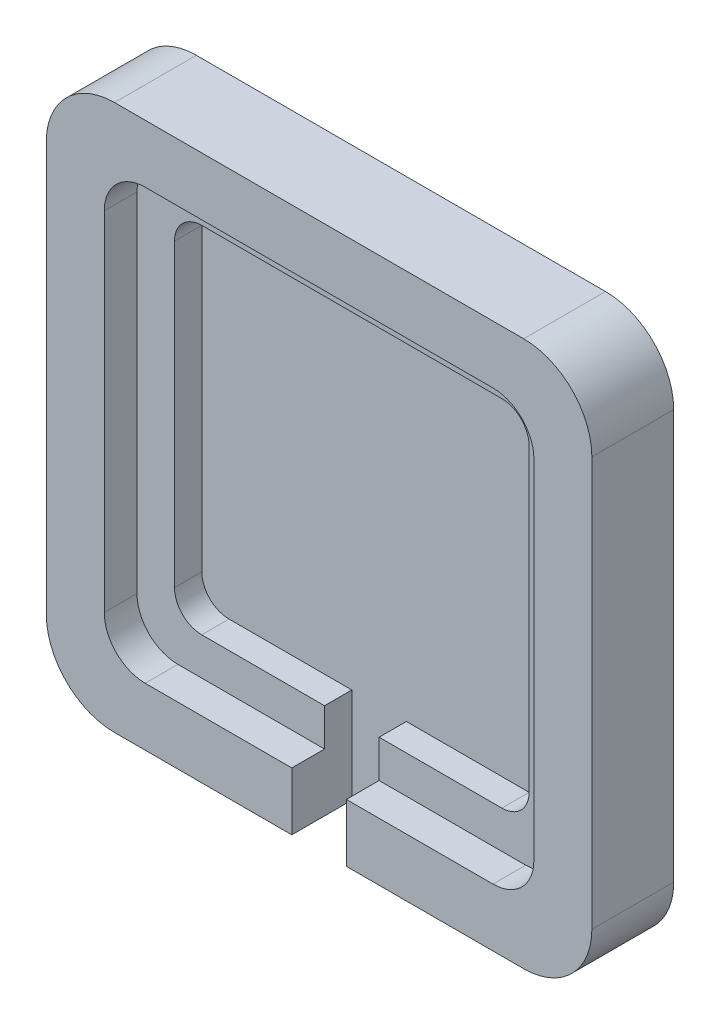
ISO-10303-21;
HEADER;
FILE_DESCRIPTION(('STEP AP214'),'2;1');
FILE_NAME('part.step','',(''),(''),'','','');
FILE_SCHEMA(('AUTOMOTIVE_DESIGN { 1 0 10303 214 1 1 1 1 }'));
ENDSEC;
DATA;
#1=APPLICATION_CONTEXT('core data for automotive mechanical design processes');
#2=APPLICATION_PROTOCOL_DEFINITION('international standard','automotive_design',2000,#1);
#3=PRODUCT_CONTEXT('',#1,'mechanical');
#4=PRODUCT('Part','Part','',(#3));
#5=PRODUCT_RELATED_PRODUCT_CATEGORY('part','',(#4));
#6=PRODUCT_DEFINITION_FORMATION('','',#4);
#7=PRODUCT_DEFINITION_CONTEXT('part definition',#1,'design');
#8=PRODUCT_DEFINITION('design','',#6,#7);
#9=PRODUCT_DEFINITION_SHAPE('','',#8);
#10=(LENGTH_UNIT() NAMED_UNIT(*) SI_UNIT(.MILLI.,.METRE.));
#11=(NAMED_UNIT(*) PLANE_ANGLE_UNIT() SI_UNIT($,.RADIAN.));
#12=(NAMED_UNIT(*) SI_UNIT($,.STERADIAN.) SOLID_ANGLE_UNIT());
#13=UNCERTAINTY_MEASURE_WITH_UNIT(LENGTH_MEASURE(1.E-05),#10,'distance_accuracy_value','');
#14=(GEOMETRIC_REPRESENTATION_CONTEXT(3) GLOBAL_UNCERTAINTY_ASSIGNED_CONTEXT((#13)) GLOBAL_UNIT_ASSIGNED_CONTEXT((#10,
#11,#12)) REPRESENTATION_CONTEXT('',''));
#15=CARTESIAN_POINT('',(0.,0.,0.));
#16=DIRECTION('',(0.,0.,1.));
#17=DIRECTION('',(1.,0.,0.));
#18=AXIS2_PLACEMENT_3D('',#15,#16,#17);
#19=CARTESIAN_POINT('',(15.75,-15.75,3.6));
#20=DIRECTION('',(0.,-1.,0.));
#21=DIRECTION('',(1.,0.,0.));
#22=AXIS2_PLACEMENT_3D('',#19,#20,#21);
#23=PLANE('',#22);
#24=DIRECTION('',(1.,0.,0.));
#25=VECTOR('',#24,1.);
#26=CARTESIAN_POINT('',(15.75,-15.75,3.6));
#27=LINE('',#26,#25);
#28=CARTESIAN_POINT('',(2.,-15.75,3.6));
#29=VERTEX_POINT('',#28);
#30=CARTESIAN_POINT('',(12.75,-15.75,3.6));
#31=VERTEX_POINT('',#30);
#32=EDGE_CURVE('E285',#29,#31,#27,.T.);
#33=ORIENTED_EDGE('',*,*,#32,.F.);
#34=DIRECTION('',(0.,0.,1.));
#35=VECTOR('',#34,1.);
#36=CARTESIAN_POINT('',(2.,-15.75,3.6));
#37=LINE('',#36,#35);
#38=CARTESIAN_POINT('',(2.,-15.75,6.));
#39=VERTEX_POINT('',#38);
#40=EDGE_CURVE('E258',#29,#39,#37,.T.);
#41=ORIENTED_EDGE('',*,*,#40,.T.);
#42=DIRECTION('',(1.,0.,0.));
#43=VECTOR('',#42,1.);
#44=CARTESIAN_POINT('',(15.75,-15.75,6.));
#45=LINE('',#44,#43);
#46=CARTESIAN_POINT('',(12.75,-15.75,6.));
#47=VERTEX_POINT('',#46);
#48=EDGE_CURVE('E299',#39,#47,#45,.T.);
#49=ORIENTED_EDGE('',*,*,#48,.T.);
#50=DIRECTION('',(0.,0.,1.));
#51=VECTOR('',#50,1.);
#52=CARTESIAN_POINT('',(12.75,-15.75,3.6));
#53=LINE('',#52,#51);
#54=EDGE_CURVE('E389',#47,#31,#53,.F.);
#55=ORIENTED_EDGE('',*,*,#54,.T.);
#56=EDGE_LOOP('',(#33,#41,#49,#55));
#57=FACE_BOUND('',#56,.T.);
#58=ADVANCED_FACE('F33',(#57),#23,.F.);
#59=CARTESIAN_POINT('',(-13.,-13.,1.6));
#60=DIRECTION('',(0.,-1.,0.));
#61=DIRECTION('',(0.,0.,-1.));
#62=AXIS2_PLACEMENT_3D('',#59,#60,#61);
#63=PLANE('',#62);
#64=DIRECTION('',(1.,0.,0.));
#65=VECTOR('',#64,1.);
#66=CARTESIAN_POINT('',(-13.,-13.,1.6));
#67=LINE('',#66,#65);
#68=CARTESIAN_POINT('',(2.,-13.,1.6));
#69=VERTEX_POINT('',#68);
#70=CARTESIAN_POINT('',(11.,-13.,1.6));
#71=VERTEX_POINT('',#70);
#72=EDGE_CURVE('E272',#69,#71,#67,.T.);
#73=ORIENTED_EDGE('',*,*,#72,.F.);
#74=DIRECTION('',(0.,0.,1.));
#75=VECTOR('',#74,1.);
#76=CARTESIAN_POINT('',(2.,-13.,1.6));
#77=LINE('',#76,#75);
#78=CARTESIAN_POINT('',(2.,-13.,3.6));
#79=VERTEX_POINT('',#78);
#80=EDGE_CURVE('E235',#69,#79,#77,.T.);
#81=ORIENTED_EDGE('',*,*,#80,.T.);
#82=DIRECTION('',(1.,0.,0.));
#83=VECTOR('',#82,1.);
#84=CARTESIAN_POINT('',(-13.,-13.,3.6));
#85=LINE('',#84,#83);
#86=CARTESIAN_POINT('',(11.,-13.,3.6));
#87=VERTEX_POINT('',#86);
#88=EDGE_CURVE('E279',#79,#87,#85,.T.);
#89=ORIENTED_EDGE('',*,*,#88,.T.);
#90=DIRECTION('',(0.,0.,1.));
#91=VECTOR('',#90,1.);
#92=CARTESIAN_POINT('',(11.,-13.,1.6));
#93=LINE('',#92,#91);
#94=EDGE_CURVE('E414',#87,#71,#93,.F.);
#95=ORIENTED_EDGE('',*,*,#94,.T.);
#96=EDGE_LOOP('',(#73,#81,#89,#95));
#97=FACE_BOUND('',#96,.T.);
#98=ADVANCED_FACE('F513',(#97),#63,.F.);
#99=CARTESIAN_POINT('',(-20.,-20.,6.));
#100=DIRECTION('',(1.,0.,0.));
#101=DIRECTION('',(0.,0.,-1.));
#102=AXIS2_PLACEMENT_3D('',#99,#100,#101);
#103=PLANE('',#102);
#104=DIRECTION('',(0.,-1.,0.));
#105=VECTOR('',#104,1.);
#106=CARTESIAN_POINT('',(-20.,-20.,0.));
#107=LINE('',#106,#105);
#108=CARTESIAN_POINT('',(-20.,15.,0.));
#109=VERTEX_POINT('',#108);
#110=CARTESIAN_POINT('',(-20.,-15.,0.));
#111=VERTEX_POINT('',#110);
#112=EDGE_CURVE('E296',#109,#111,#107,.T.);
#113=ORIENTED_EDGE('',*,*,#112,.T.);
#114=DIRECTION('',(0.,0.,-1.));
#115=VECTOR('',#114,1.);
#116=CARTESIAN_POINT('',(-20.,-15.,6.));
#117=LINE('',#116,#115);
#118=CARTESIAN_POINT('',(-20.,-15.,6.));
#119=VERTEX_POINT('',#118);
#120=EDGE_CURVE('E348',#111,#119,#117,.F.);
#121=ORIENTED_EDGE('',*,*,#120,.T.);
#122=DIRECTION('',(0.,-1.,0.));
#123=VECTOR('',#122,1.);
#124=CARTESIAN_POINT('',(-20.,-20.,6.));
#125=LINE('',#124,#123);
#126=CARTESIAN_POINT('',(-20.,15.,6.));
#127=VERTEX_POINT('',#126);
#128=EDGE_CURVE('E308',#127,#119,#125,.T.);
#129=ORIENTED_EDGE('',*,*,#128,.F.);
#130=DIRECTION('',(0.,0.,-1.));
#131=VECTOR('',#130,1.);
#132=CARTESIAN_POINT('',(-20.,15.,6.));
#133=LINE('',#132,#131);
#134=EDGE_CURVE('E345',#127,#109,#133,.T.);
#135=ORIENTED_EDGE('',*,*,#134,.T.);
#136=EDGE_LOOP('',(#113,#121,#129,#135));
#137=FACE_BOUND('',#136,.T.);
#138=ADVANCED_FACE('F547',(#137),#103,.F.);
#139=CARTESIAN_POINT('',(20.,-20.,6.));
#140=DIRECTION('',(0.,1.,0.));
#141=DIRECTION('',(-1.,0.,0.));
#142=AXIS2_PLACEMENT_3D('',#139,#140,#141);
#143=PLANE('',#142);
#144=DIRECTION('',(1.,0.,0.));
#145=VECTOR('',#144,1.);
#146=CARTESIAN_POINT('',(20.,-20.,6.));
#147=LINE('',#146,#145);
#148=CARTESIAN_POINT('',(2.,-20.,6.));
#149=VERTEX_POINT('',#148);
#150=CARTESIAN_POINT('',(15.,-20.,6.));
#151=VERTEX_POINT('',#150);
#152=EDGE_CURVE('E311',#149,#151,#147,.T.);
#153=ORIENTED_EDGE('',*,*,#152,.F.);
#154=DIRECTION('',(0.,0.,-1.));
#155=VECTOR('',#154,1.);
#156=CARTESIAN_POINT('',(2.,-20.,6.));
#157=LINE('',#156,#155);
#158=CARTESIAN_POINT('',(2.,-20.,1.6));
#159=VERTEX_POINT('',#158);
#160=EDGE_CURVE('E252',#149,#159,#157,.T.);
#161=ORIENTED_EDGE('',*,*,#160,.T.);
#162=DIRECTION('',(-1.,0.,0.));
#163=VECTOR('',#162,1.);
#164=CARTESIAN_POINT('',(20.,-20.,1.6));
#165=LINE('',#164,#163);
#166=CARTESIAN_POINT('',(-2.,-20.,1.6));
#167=VERTEX_POINT('',#166);
#168=EDGE_CURVE('E242',#159,#167,#165,.T.);
#169=ORIENTED_EDGE('',*,*,#168,.T.);
#170=DIRECTION('',(0.,0.,1.));
#171=VECTOR('',#170,1.);
#172=CARTESIAN_POINT('',(-2.,-20.,6.));
#173=LINE('',#172,#171);
#174=CARTESIAN_POINT('',(-2.,-20.,6.));
#175=VERTEX_POINT('',#174);
#176=EDGE_CURVE('E227',#167,#175,#173,.T.);
#177=ORIENTED_EDGE('',*,*,#176,.T.);
#178=CARTESIAN_POINT('',(-15.,-20.,6.));
#179=VERTEX_POINT('',#178);
#180=EDGE_CURVE('E313',#179,#175,#147,.T.);
#181=ORIENTED_EDGE('',*,*,#180,.F.);
#182=DIRECTION('',(0.,0.,-1.));
#183=VECTOR('',#182,1.);
#184=CARTESIAN_POINT('',(-15.,-20.,6.));
#185=LINE('',#184,#183);
#186=CARTESIAN_POINT('',(-15.,-20.,0.));
#187=VERTEX_POINT('',#186);
#188=EDGE_CURVE('E334',#179,#187,#185,.T.);
#189=ORIENTED_EDGE('',*,*,#188,.T.);
#190=DIRECTION('',(1.,0.,0.));
#191=VECTOR('',#190,1.);
#192=CARTESIAN_POINT('',(20.,-20.,0.));
#193=LINE('',#192,#191);
#194=CARTESIAN_POINT('',(15.,-20.,0.));
#195=VERTEX_POINT('',#194);
#196=EDGE_CURVE('E324',#187,#195,#193,.T.);
#197=ORIENTED_EDGE('',*,*,#196,.T.);
#198=DIRECTION('',(0.,0.,-1.));
#199=VECTOR('',#198,1.);
#200=CARTESIAN_POINT('',(15.,-20.,6.));
#201=LINE('',#200,#199);
#202=EDGE_CURVE('E321',#195,#151,#201,.F.);
#203=ORIENTED_EDGE('',*,*,#202,.T.);
#204=EDGE_LOOP('',(#153,#161,#169,#177,#181,#189,#197,#203));
#205=FACE_BOUND('',#204,.T.);
#206=ADVANCED_FACE('F251',(#205),#143,.F.);
#207=CARTESIAN_POINT('',(20.,-20.,6.));
#208=DIRECTION('',(-1.,0.,0.));
#209=DIRECTION('',(0.,0.,1.));
#210=AXIS2_PLACEMENT_3D('',#207,#208,#209);
#211=PLANE('',#210);
#212=DIRECTION('',(0.,1.,0.));
#213=VECTOR('',#212,1.);
#214=CARTESIAN_POINT('',(20.,-20.,0.));
#215=LINE('',#214,#213);
#216=CARTESIAN_POINT('',(20.,-15.,0.));
#217=VERTEX_POINT('',#216);
#218=CARTESIAN_POINT('',(20.,15.,0.));
#219=VERTEX_POINT('',#218);
#220=EDGE_CURVE('E327',#217,#219,#215,.T.);
#221=ORIENTED_EDGE('',*,*,#220,.T.);
#222=DIRECTION('',(0.,0.,-1.));
#223=VECTOR('',#222,1.);
#224=CARTESIAN_POINT('',(20.,15.,6.));
#225=LINE('',#224,#223);
#226=CARTESIAN_POINT('',(20.,15.,6.));
#227=VERTEX_POINT('',#226);
#228=EDGE_CURVE('E366',#219,#227,#225,.F.);
#229=ORIENTED_EDGE('',*,*,#228,.T.);
#230=DIRECTION('',(0.,1.,0.));
#231=VECTOR('',#230,1.);
#232=CARTESIAN_POINT('',(20.,-20.,6.));
#233=LINE('',#232,#231);
#234=CARTESIAN_POINT('',(20.,-15.,6.));
#235=VERTEX_POINT('',#234);
#236=EDGE_CURVE('E315',#235,#227,#233,.T.);
#237=ORIENTED_EDGE('',*,*,#236,.F.);
#238=DIRECTION('',(0.,0.,-1.));
#239=VECTOR('',#238,1.);
#240=CARTESIAN_POINT('',(20.,-15.,6.));
#241=LINE('',#240,#239);
#242=EDGE_CURVE('E363',#235,#217,#241,.T.);
#243=ORIENTED_EDGE('',*,*,#242,.T.);
#244=EDGE_LOOP('',(#221,#229,#237,#243));
#245=FACE_BOUND('',#244,.T.);
#246=ADVANCED_FACE('F609',(#245),#211,.F.);
#247=CARTESIAN_POINT('',(20.,20.,6.));
#248=DIRECTION('',(0.,-1.,0.));
#249=DIRECTION('',(1.,0.,0.));
#250=AXIS2_PLACEMENT_3D('',#247,#248,#249);
#251=PLANE('',#250);
#252=DIRECTION('',(-1.,0.,0.));
#253=VECTOR('',#252,1.);
#254=CARTESIAN_POINT('',(20.,20.,0.));
#255=LINE('',#254,#253);
#256=CARTESIAN_POINT('',(15.,20.,0.));
#257=VERTEX_POINT('',#256);
#258=CARTESIAN_POINT('',(-15.,20.,0.));
#259=VERTEX_POINT('',#258);
#260=EDGE_CURVE('E312',#257,#259,#255,.T.);
#261=ORIENTED_EDGE('',*,*,#260,.T.);
#262=DIRECTION('',(0.,0.,-1.));
#263=VECTOR('',#262,1.);
#264=CARTESIAN_POINT('',(-15.,20.,6.));
#265=LINE('',#264,#263);
#266=CARTESIAN_POINT('',(-15.,20.,6.));
#267=VERTEX_POINT('',#266);
#268=EDGE_CURVE('E361',#259,#267,#265,.F.);
#269=ORIENTED_EDGE('',*,*,#268,.T.);
#270=DIRECTION('',(-1.,0.,0.));
#271=VECTOR('',#270,1.);
#272=CARTESIAN_POINT('',(20.,20.,6.));
#273=LINE('',#272,#271);
#274=CARTESIAN_POINT('',(15.,20.,6.));
#275=VERTEX_POINT('',#274);
#276=EDGE_CURVE('E318',#275,#267,#273,.T.);
#277=ORIENTED_EDGE('',*,*,#276,.F.);
#278=DIRECTION('',(0.,0.,-1.));
#279=VECTOR('',#278,1.);
#280=CARTESIAN_POINT('',(15.,20.,6.));
#281=LINE('',#280,#279);
#282=EDGE_CURVE('E358',#275,#257,#281,.T.);
#283=ORIENTED_EDGE('',*,*,#282,.T.);
#284=EDGE_LOOP('',(#261,#269,#277,#283));
#285=FACE_BOUND('',#284,.T.);
#286=ADVANCED_FACE('F621',(#285),#251,.F.);
#287=CARTESIAN_POINT('',(0.,0.,6.));
#288=DIRECTION('',(0.,0.,1.));
#289=DIRECTION('',(1.,0.,0.));
#290=AXIS2_PLACEMENT_3D('',#287,#288,#289);
#291=PLANE('',#290);
#292=DIRECTION('',(0.,1.,0.));
#293=VECTOR('',#292,1.);
#294=CARTESIAN_POINT('',(2.,-12.27750489836,6.));
#295=LINE('',#294,#293);
#296=EDGE_CURVE('E472',#149,#39,#295,.T.);
#297=ORIENTED_EDGE('',*,*,#296,.F.);
#298=ORIENTED_EDGE('',*,*,#152,.T.);
#299=CARTESIAN_POINT('',(15.,-15.,6.));
#300=DIRECTION('',(0.,0.,1.));
#301=DIRECTION('',(1.,0.,0.));
#302=AXIS2_PLACEMENT_3D('',#299,#300,#301);
#303=CIRCLE('',#302,5.);
#304=EDGE_CURVE('E350',#151,#235,#303,.T.);
#305=ORIENTED_EDGE('',*,*,#304,.T.);
#306=ORIENTED_EDGE('',*,*,#236,.T.);
#307=CARTESIAN_POINT('',(15.,15.,6.));
#308=DIRECTION('',(0.,0.,1.));
#309=DIRECTION('',(1.,0.,0.));
#310=AXIS2_PLACEMENT_3D('',#307,#308,#309);
#311=CIRCLE('',#310,5.);
#312=EDGE_CURVE('E352',#227,#275,#311,.T.);
#313=ORIENTED_EDGE('',*,*,#312,.T.);
#314=ORIENTED_EDGE('',*,*,#276,.T.);
#315=CARTESIAN_POINT('',(-15.,15.,6.));
#316=DIRECTION('',(0.,0.,1.));
#317=DIRECTION('',(1.,0.,0.));
#318=AXIS2_PLACEMENT_3D('',#315,#316,#317);
#319=CIRCLE('',#318,5.);
#320=EDGE_CURVE('E354',#267,#127,#319,.T.);
#321=ORIENTED_EDGE('',*,*,#320,.T.);
#322=ORIENTED_EDGE('',*,*,#128,.T.);
#323=CARTESIAN_POINT('',(-15.,-15.,6.));
#324=DIRECTION('',(0.,0.,1.));
#325=DIRECTION('',(1.,0.,0.));
#326=AXIS2_PLACEMENT_3D('',#323,#324,#325);
#327=CIRCLE('',#326,5.);
#328=EDGE_CURVE('E356',#119,#179,#327,.T.);
#329=ORIENTED_EDGE('',*,*,#328,.T.);
#330=ORIENTED_EDGE('',*,*,#180,.T.);
#331=DIRECTION('',(0.,-1.,0.));
#332=VECTOR('',#331,1.);
#333=CARTESIAN_POINT('',(-2.,-12.27750489836,6.));
#334=LINE('',#333,#332);
#335=CARTESIAN_POINT('',(-2.,-15.75,6.));
#336=VERTEX_POINT('',#335);
#337=EDGE_CURVE('E230',#336,#175,#334,.T.);
#338=ORIENTED_EDGE('',*,*,#337,.F.);
#339=CARTESIAN_POINT('',(-12.75,-15.75,6.));
#340=VERTEX_POINT('',#339);
#341=EDGE_CURVE('E300',#340,#336,#45,.T.);
#342=ORIENTED_EDGE('',*,*,#341,.F.);
#343=CARTESIAN_POINT('',(-12.75,-12.75,6.));
#344=DIRECTION('',(0.,0.,1.));
#345=DIRECTION('',(1.,0.,0.));
#346=AXIS2_PLACEMENT_3D('',#343,#344,#345);
#347=CIRCLE('',#346,3.);
#348=CARTESIAN_POINT('',(-15.75,-12.75,6.));
#349=VERTEX_POINT('',#348);
#350=EDGE_CURVE('E402',#340,#349,#347,.F.);
#351=ORIENTED_EDGE('',*,*,#350,.T.);
#352=DIRECTION('',(0.,-1.,0.));
#353=VECTOR('',#352,1.);
#354=CARTESIAN_POINT('',(-15.75,-15.75,6.));
#355=LINE('',#354,#353);
#356=CARTESIAN_POINT('',(-15.75,12.75,6.));
#357=VERTEX_POINT('',#356);
#358=EDGE_CURVE('E273',#357,#349,#355,.T.);
#359=ORIENTED_EDGE('',*,*,#358,.F.);
#360=CARTESIAN_POINT('',(-12.75,12.75,6.));
#361=DIRECTION('',(0.,0.,1.));
#362=DIRECTION('',(1.,0.,0.));
#363=AXIS2_PLACEMENT_3D('',#360,#361,#362);
#364=CIRCLE('',#363,3.);
#365=CARTESIAN_POINT('',(-12.75,15.75,6.));
#366=VERTEX_POINT('',#365);
#367=EDGE_CURVE('E404',#357,#366,#364,.F.);
#368=ORIENTED_EDGE('',*,*,#367,.T.);
#369=DIRECTION('',(-1.,0.,0.));
#370=VECTOR('',#369,1.);
#371=CARTESIAN_POINT('',(15.75,15.75,6.));
#372=LINE('',#371,#370);
#373=CARTESIAN_POINT('',(12.75,15.75,6.));
#374=VERTEX_POINT('',#373);
#375=EDGE_CURVE('E286',#374,#366,#372,.T.);
#376=ORIENTED_EDGE('',*,*,#375,.F.);
#377=CARTESIAN_POINT('',(12.75,12.75,6.));
#378=DIRECTION('',(0.,0.,1.));
#379=DIRECTION('',(1.,0.,0.));
#380=AXIS2_PLACEMENT_3D('',#377,#378,#379);
#381=CIRCLE('',#380,3.);
#382=CARTESIAN_POINT('',(15.75,12.75,6.));
#383=VERTEX_POINT('',#382);
#384=EDGE_CURVE('E397',#374,#383,#381,.F.);
#385=ORIENTED_EDGE('',*,*,#384,.T.);
#386=DIRECTION('',(0.,1.,0.));
#387=VECTOR('',#386,1.);
#388=CARTESIAN_POINT('',(15.75,-15.75,6.));
#389=LINE('',#388,#387);
#390=CARTESIAN_POINT('',(15.75,-12.75,6.));
#391=VERTEX_POINT('',#390);
#392=EDGE_CURVE('E303',#391,#383,#389,.T.);
#393=ORIENTED_EDGE('',*,*,#392,.F.);
#394=CARTESIAN_POINT('',(12.75,-12.75,6.));
#395=DIRECTION('',(0.,0.,1.));
#396=DIRECTION('',(1.,0.,0.));
#397=AXIS2_PLACEMENT_3D('',#394,#395,#396);
#398=CIRCLE('',#397,3.);
#399=EDGE_CURVE('E399',#391,#47,#398,.F.);
#400=ORIENTED_EDGE('',*,*,#399,.T.);
#401=ORIENTED_EDGE('',*,*,#48,.F.);
#402=EDGE_LOOP('',(#297,#298,#305,#306,#313,#314,#321,#322,#329,#330,#338,#342,#351,#359,#368,
#376,#385,#393,#400,#401));
#403=FACE_BOUND('',#402,.T.);
#404=ADVANCED_FACE('F471',(#403),#291,.T.);
#405=CARTESIAN_POINT('',(0.,0.,0.));
#406=DIRECTION('',(0.,0.,1.));
#407=DIRECTION('',(1.,0.,0.));
#408=AXIS2_PLACEMENT_3D('',#405,#406,#407);
#409=PLANE('',#408);
#410=ORIENTED_EDGE('',*,*,#196,.F.);
#411=CARTESIAN_POINT('',(-15.,-15.,0.));
#412=DIRECTION('',(0.,0.,1.));
#413=DIRECTION('',(1.,0.,0.));
#414=AXIS2_PLACEMENT_3D('',#411,#412,#413);
#415=CIRCLE('',#414,5.);
#416=EDGE_CURVE('E343',#187,#111,#415,.F.);
#417=ORIENTED_EDGE('',*,*,#416,.T.);
#418=ORIENTED_EDGE('',*,*,#112,.F.);
#419=CARTESIAN_POINT('',(-15.,15.,0.));
#420=DIRECTION('',(0.,0.,1.));
#421=DIRECTION('',(1.,0.,0.));
#422=AXIS2_PLACEMENT_3D('',#419,#420,#421);
#423=CIRCLE('',#422,5.);
#424=EDGE_CURVE('E341',#109,#259,#423,.F.);
#425=ORIENTED_EDGE('',*,*,#424,.T.);
#426=ORIENTED_EDGE('',*,*,#260,.F.);
#427=CARTESIAN_POINT('',(15.,15.,0.));
#428=DIRECTION('',(0.,0.,1.));
#429=DIRECTION('',(1.,0.,0.));
#430=AXIS2_PLACEMENT_3D('',#427,#428,#429);
#431=CIRCLE('',#430,5.);
#432=EDGE_CURVE('E339',#257,#219,#431,.F.);
#433=ORIENTED_EDGE('',*,*,#432,.T.);
#434=ORIENTED_EDGE('',*,*,#220,.F.);
#435=CARTESIAN_POINT('',(15.,-15.,0.));
#436=DIRECTION('',(0.,0.,1.));
#437=DIRECTION('',(1.,0.,0.));
#438=AXIS2_PLACEMENT_3D('',#435,#436,#437);
#439=CIRCLE('',#438,5.);
#440=EDGE_CURVE('E337',#217,#195,#439,.F.);
#441=ORIENTED_EDGE('',*,*,#440,.T.);
#442=EDGE_LOOP('',(#410,#417,#418,#425,#426,#433,#434,#441));
#443=FACE_BOUND('',#442,.T.);
#444=ADVANCED_FACE('F620',(#443),#409,.F.);
#445=CARTESIAN_POINT('',(-15.,-15.,6.));
#446=DIRECTION('',(0.,0.,-1.));
#447=DIRECTION('',(-1.,0.,0.));
#448=AXIS2_PLACEMENT_3D('',#445,#446,#447);
#449=CYLINDRICAL_SURFACE('',#448,5.);
#450=ORIENTED_EDGE('',*,*,#328,.F.);
#451=ORIENTED_EDGE('',*,*,#120,.F.);
#452=ORIENTED_EDGE('',*,*,#416,.F.);
#453=ORIENTED_EDGE('',*,*,#188,.F.);
#454=EDGE_LOOP('',(#450,#451,#452,#453));
#455=FACE_BOUND('',#454,.T.);
#456=ADVANCED_FACE('F761',(#455),#449,.T.);
#457=CARTESIAN_POINT('',(-15.,15.,6.));
#458=DIRECTION('',(0.,0.,-1.));
#459=DIRECTION('',(-1.,0.,0.));
#460=AXIS2_PLACEMENT_3D('',#457,#458,#459);
#461=CYLINDRICAL_SURFACE('',#460,5.);
#462=ORIENTED_EDGE('',*,*,#320,.F.);
#463=ORIENTED_EDGE('',*,*,#268,.F.);
#464=ORIENTED_EDGE('',*,*,#424,.F.);
#465=ORIENTED_EDGE('',*,*,#134,.F.);
#466=EDGE_LOOP('',(#462,#463,#464,#465));
#467=FACE_BOUND('',#466,.T.);
#468=ADVANCED_FACE('F751',(#467),#461,.T.);
#469=CARTESIAN_POINT('',(15.,15.,6.));
#470=DIRECTION('',(0.,0.,-1.));
#471=DIRECTION('',(-1.,0.,0.));
#472=AXIS2_PLACEMENT_3D('',#469,#470,#471);
#473=CYLINDRICAL_SURFACE('',#472,5.);
#474=ORIENTED_EDGE('',*,*,#312,.F.);
#475=ORIENTED_EDGE('',*,*,#228,.F.);
#476=ORIENTED_EDGE('',*,*,#432,.F.);
#477=ORIENTED_EDGE('',*,*,#282,.F.);
#478=EDGE_LOOP('',(#474,#475,#476,#477));
#479=FACE_BOUND('',#478,.T.);
#480=ADVANCED_FACE('F741',(#479),#473,.T.);
#481=CARTESIAN_POINT('',(15.,-15.,6.));
#482=DIRECTION('',(0.,0.,-1.));
#483=DIRECTION('',(-1.,0.,0.));
#484=AXIS2_PLACEMENT_3D('',#481,#482,#483);
#485=CYLINDRICAL_SURFACE('',#484,5.);
#486=ORIENTED_EDGE('',*,*,#304,.F.);
#487=ORIENTED_EDGE('',*,*,#202,.F.);
#488=ORIENTED_EDGE('',*,*,#440,.F.);
#489=ORIENTED_EDGE('',*,*,#242,.F.);
#490=EDGE_LOOP('',(#486,#487,#488,#489));
#491=FACE_BOUND('',#490,.T.);
#492=ADVANCED_FACE('F733',(#491),#485,.T.);
#493=CARTESIAN_POINT('',(-15.75,-15.75,3.6));
#494=DIRECTION('',(-1.,0.,0.));
#495=DIRECTION('',(0.,0.,1.));
#496=AXIS2_PLACEMENT_3D('',#493,#494,#495);
#497=PLANE('',#496);
#498=ORIENTED_EDGE('',*,*,#358,.T.);
#499=DIRECTION('',(0.,0.,1.));
#500=VECTOR('',#499,1.);
#501=CARTESIAN_POINT('',(-15.75,-12.75,3.6));
#502=LINE('',#501,#500);
#503=CARTESIAN_POINT('',(-15.75,-12.75,3.6));
#504=VERTEX_POINT('',#503);
#505=EDGE_CURVE('E395',#349,#504,#502,.F.);
#506=ORIENTED_EDGE('',*,*,#505,.T.);
#507=DIRECTION('',(0.,-1.,0.));
#508=VECTOR('',#507,1.);
#509=CARTESIAN_POINT('',(-15.75,-15.75,3.6));
#510=LINE('',#509,#508);
#511=CARTESIAN_POINT('',(-15.75,12.75,3.6));
#512=VERTEX_POINT('',#511);
#513=EDGE_CURVE('E282',#512,#504,#510,.T.);
#514=ORIENTED_EDGE('',*,*,#513,.F.);
#515=DIRECTION('',(0.,0.,1.));
#516=VECTOR('',#515,1.);
#517=CARTESIAN_POINT('',(-15.75,12.75,6.));
#518=LINE('',#517,#516);
#519=EDGE_CURVE('E392',#512,#357,#518,.T.);
#520=ORIENTED_EDGE('',*,*,#519,.T.);
#521=EDGE_LOOP('',(#498,#506,#514,#520));
#522=FACE_BOUND('',#521,.T.);
#523=ADVANCED_FACE('F499',(#522),#497,.F.);
#524=CARTESIAN_POINT('',(15.75,15.75,3.6));
#525=DIRECTION('',(0.,1.,0.));
#526=DIRECTION('',(-1.,0.,0.));
#527=AXIS2_PLACEMENT_3D('',#524,#525,#526);
#528=PLANE('',#527);
#529=DIRECTION('',(-1.,0.,0.));
#530=VECTOR('',#529,1.);
#531=CARTESIAN_POINT('',(15.75,15.75,3.6));
#532=LINE('',#531,#530);
#533=CARTESIAN_POINT('',(12.75,15.75,3.6));
#534=VERTEX_POINT('',#533);
#535=CARTESIAN_POINT('',(-12.75,15.75,3.6));
#536=VERTEX_POINT('',#535);
#537=EDGE_CURVE('E293',#534,#536,#532,.T.);
#538=ORIENTED_EDGE('',*,*,#537,.F.);
#539=DIRECTION('',(0.,0.,1.));
#540=VECTOR('',#539,1.);
#541=CARTESIAN_POINT('',(12.75,15.75,6.));
#542=LINE('',#541,#540);
#543=EDGE_CURVE('E370',#534,#374,#542,.T.);
#544=ORIENTED_EDGE('',*,*,#543,.T.);
#545=ORIENTED_EDGE('',*,*,#375,.T.);
#546=DIRECTION('',(0.,0.,1.));
#547=VECTOR('',#546,1.);
#548=CARTESIAN_POINT('',(-12.75,15.75,3.6));
#549=LINE('',#548,#547);
#550=EDGE_CURVE('E368',#366,#536,#549,.F.);
#551=ORIENTED_EDGE('',*,*,#550,.T.);
#552=EDGE_LOOP('',(#538,#544,#545,#551));
#553=FACE_BOUND('',#552,.T.);
#554=ADVANCED_FACE('F490',(#553),#528,.F.);
#555=CARTESIAN_POINT('',(15.75,-15.75,3.6));
#556=DIRECTION('',(1.,0.,0.));
#557=DIRECTION('',(0.,0.,-1.));
#558=AXIS2_PLACEMENT_3D('',#555,#556,#557);
#559=PLANE('',#558);
#560=ORIENTED_EDGE('',*,*,#392,.T.);
#561=DIRECTION('',(0.,0.,1.));
#562=VECTOR('',#561,1.);
#563=CARTESIAN_POINT('',(15.75,12.75,3.6));
#564=LINE('',#563,#562);
#565=CARTESIAN_POINT('',(15.75,12.75,3.6));
#566=VERTEX_POINT('',#565);
#567=EDGE_CURVE('E376',#383,#566,#564,.F.);
#568=ORIENTED_EDGE('',*,*,#567,.T.);
#569=DIRECTION('',(0.,1.,0.));
#570=VECTOR('',#569,1.);
#571=CARTESIAN_POINT('',(15.75,-15.75,3.6));
#572=LINE('',#571,#570);
#573=CARTESIAN_POINT('',(15.75,-12.75,3.6));
#574=VERTEX_POINT('',#573);
#575=EDGE_CURVE('E290',#574,#566,#572,.T.);
#576=ORIENTED_EDGE('',*,*,#575,.F.);
#577=DIRECTION('',(0.,0.,1.));
#578=VECTOR('',#577,1.);
#579=CARTESIAN_POINT('',(15.75,-12.75,6.));
#580=LINE('',#579,#578);
#581=EDGE_CURVE('E373',#574,#391,#580,.T.);
#582=ORIENTED_EDGE('',*,*,#581,.T.);
#583=EDGE_LOOP('',(#560,#568,#576,#582));
#584=FACE_BOUND('',#583,.T.);
#585=ADVANCED_FACE('F482',(#584),#559,.F.);
#586=ORIENTED_EDGE('',*,*,#341,.T.);
#587=DIRECTION('',(0.,0.,-1.));
#588=VECTOR('',#587,1.);
#589=CARTESIAN_POINT('',(-2.,-15.75,3.6));
#590=LINE('',#589,#588);
#591=CARTESIAN_POINT('',(-2.,-15.75,3.6));
#592=VERTEX_POINT('',#591);
#593=EDGE_CURVE('E236',#336,#592,#590,.T.);
#594=ORIENTED_EDGE('',*,*,#593,.T.);
#595=CARTESIAN_POINT('',(-12.75,-15.75,3.6));
#596=VERTEX_POINT('',#595);
#597=EDGE_CURVE('E287',#596,#592,#27,.T.);
#598=ORIENTED_EDGE('',*,*,#597,.F.);
#599=DIRECTION('',(0.,0.,1.));
#600=VECTOR('',#599,1.);
#601=CARTESIAN_POINT('',(-12.75,-15.75,6.));
#602=LINE('',#601,#600);
#603=EDGE_CURVE('E386',#596,#340,#602,.T.);
#604=ORIENTED_EDGE('',*,*,#603,.T.);
#605=EDGE_LOOP('',(#586,#594,#598,#604));
#606=FACE_BOUND('',#605,.T.);
#607=ADVANCED_FACE('F507',(#606),#23,.F.);
#608=CARTESIAN_POINT('',(0.,0.,3.6));
#609=DIRECTION('',(0.,0.,1.));
#610=DIRECTION('',(1.,0.,0.));
#611=AXIS2_PLACEMENT_3D('',#608,#609,#610);
#612=PLANE('',#611);
#613=DIRECTION('',(0.,1.,0.));
#614=VECTOR('',#613,1.);
#615=CARTESIAN_POINT('',(1.99999999999999,0.,3.6));
#616=LINE('',#615,#614);
#617=EDGE_CURVE('E463',#29,#79,#616,.T.);
#618=ORIENTED_EDGE('',*,*,#617,.F.);
#619=ORIENTED_EDGE('',*,*,#32,.T.);
#620=CARTESIAN_POINT('',(12.75,-12.75,3.6));
#621=DIRECTION('',(0.,0.,1.));
#622=DIRECTION('',(1.,0.,0.));
#623=AXIS2_PLACEMENT_3D('',#620,#621,#622);
#624=CIRCLE('',#623,3.);
#625=EDGE_CURVE('E382',#31,#574,#624,.T.);
#626=ORIENTED_EDGE('',*,*,#625,.T.);
#627=ORIENTED_EDGE('',*,*,#575,.T.);
#628=CARTESIAN_POINT('',(12.75,12.75,3.6));
#629=DIRECTION('',(0.,0.,1.));
#630=DIRECTION('',(1.,0.,0.));
#631=AXIS2_PLACEMENT_3D('',#628,#629,#630);
#632=CIRCLE('',#631,3.);
#633=EDGE_CURVE('E384',#566,#534,#632,.T.);
#634=ORIENTED_EDGE('',*,*,#633,.T.);
#635=ORIENTED_EDGE('',*,*,#537,.T.);
#636=CARTESIAN_POINT('',(-12.75,12.75,3.6));
#637=DIRECTION('',(0.,0.,1.));
#638=DIRECTION('',(1.,0.,0.));
#639=AXIS2_PLACEMENT_3D('',#636,#637,#638);
#640=CIRCLE('',#639,3.);
#641=EDGE_CURVE('E378',#536,#512,#640,.T.);
#642=ORIENTED_EDGE('',*,*,#641,.T.);
#643=ORIENTED_EDGE('',*,*,#513,.T.);
#644=CARTESIAN_POINT('',(-12.75,-12.75,3.6));
#645=DIRECTION('',(0.,0.,1.));
#646=DIRECTION('',(1.,0.,0.));
#647=AXIS2_PLACEMENT_3D('',#644,#645,#646);
#648=CIRCLE('',#647,3.);
#649=EDGE_CURVE('E380',#504,#596,#648,.T.);
#650=ORIENTED_EDGE('',*,*,#649,.T.);
#651=ORIENTED_EDGE('',*,*,#597,.T.);
#652=DIRECTION('',(0.,-1.,0.));
#653=VECTOR('',#652,1.);
#654=CARTESIAN_POINT('',(-2.,0.,3.6));
#655=LINE('',#654,#653);
#656=CARTESIAN_POINT('',(-2.,-13.,3.6));
#657=VERTEX_POINT('',#656);
#658=EDGE_CURVE('E454',#657,#592,#655,.T.);
#659=ORIENTED_EDGE('',*,*,#658,.F.);
#660=CARTESIAN_POINT('',(-11.,-13.,3.6));
#661=VERTEX_POINT('',#660);
#662=EDGE_CURVE('E266',#661,#657,#85,.T.);
#663=ORIENTED_EDGE('',*,*,#662,.F.);
#664=CARTESIAN_POINT('',(-11.,-11.,3.6));
#665=DIRECTION('',(0.,0.,1.));
#666=DIRECTION('',(1.,0.,0.));
#667=AXIS2_PLACEMENT_3D('',#664,#665,#666);
#668=CIRCLE('',#667,2.);
#669=CARTESIAN_POINT('',(-13.,-11.,3.6));
#670=VERTEX_POINT('',#669);
#671=EDGE_CURVE('E438',#661,#670,#668,.F.);
#672=ORIENTED_EDGE('',*,*,#671,.T.);
#673=DIRECTION('',(0.,-1.,0.));
#674=VECTOR('',#673,1.);
#675=CARTESIAN_POINT('',(-13.,-13.,3.6));
#676=LINE('',#675,#674);
#677=CARTESIAN_POINT('',(-13.,11.,3.6));
#678=VERTEX_POINT('',#677);
#679=EDGE_CURVE('E276',#678,#670,#676,.T.);
#680=ORIENTED_EDGE('',*,*,#679,.F.);
#681=CARTESIAN_POINT('',(-11.,11.,3.6));
#682=DIRECTION('',(0.,0.,1.));
#683=DIRECTION('',(1.,0.,0.));
#684=AXIS2_PLACEMENT_3D('',#681,#682,#683);
#685=CIRCLE('',#684,2.);
#686=CARTESIAN_POINT('',(-11.,13.,3.6));
#687=VERTEX_POINT('',#686);
#688=EDGE_CURVE('E41',#678,#687,#685,.F.);
#689=ORIENTED_EDGE('',*,*,#688,.T.);
#690=DIRECTION('',(-1.,0.,0.));
#691=VECTOR('',#690,1.);
#692=CARTESIAN_POINT('',(-13.,13.,3.6));
#693=LINE('',#692,#691);
#694=CARTESIAN_POINT('',(11.,13.,3.6));
#695=VERTEX_POINT('',#694);
#696=EDGE_CURVE('E256',#695,#687,#693,.T.);
#697=ORIENTED_EDGE('',*,*,#696,.F.);
#698=CARTESIAN_POINT('',(11.,11.,3.6));
#699=DIRECTION('',(0.,0.,1.));
#700=DIRECTION('',(1.,0.,0.));
#701=AXIS2_PLACEMENT_3D('',#698,#699,#700);
#702=CIRCLE('',#701,2.);
#703=CARTESIAN_POINT('',(13.,11.,3.6));
#704=VERTEX_POINT('',#703);
#705=EDGE_CURVE('E11',#695,#704,#702,.F.);
#706=ORIENTED_EDGE('',*,*,#705,.T.);
#707=DIRECTION('',(0.,1.,0.));
#708=VECTOR('',#707,1.);
#709=CARTESIAN_POINT('',(13.,-13.,3.6));
#710=LINE('',#709,#708);
#711=CARTESIAN_POINT('',(13.,-11.,3.6));
#712=VERTEX_POINT('',#711);
#713=EDGE_CURVE('E253',#712,#704,#710,.T.);
#714=ORIENTED_EDGE('',*,*,#713,.F.);
#715=CARTESIAN_POINT('',(11.,-11.,3.6));
#716=DIRECTION('',(0.,0.,1.));
#717=DIRECTION('',(1.,0.,0.));
#718=AXIS2_PLACEMENT_3D('',#715,#716,#717);
#719=CIRCLE('',#718,2.);
#720=EDGE_CURVE('E435',#712,#87,#719,.F.);
#721=ORIENTED_EDGE('',*,*,#720,.T.);
#722=ORIENTED_EDGE('',*,*,#88,.F.);
#723=EDGE_LOOP('',(#618,#619,#626,#627,#634,#635,#642,#643,#650,#651,#659,#663,#672,#680,#689,
#697,#706,#714,#721,#722));
#724=FACE_BOUND('',#723,.T.);
#725=ADVANCED_FACE('F441',(#724),#612,.T.);
#726=CARTESIAN_POINT('',(12.75,12.75,3.6));
#727=DIRECTION('',(0.,0.,-1.));
#728=DIRECTION('',(-1.,0.,0.));
#729=AXIS2_PLACEMENT_3D('',#726,#727,#728);
#730=CYLINDRICAL_SURFACE('',#729,3.);
#731=ORIENTED_EDGE('',*,*,#633,.F.);
#732=ORIENTED_EDGE('',*,*,#567,.F.);
#733=ORIENTED_EDGE('',*,*,#384,.F.);
#734=ORIENTED_EDGE('',*,*,#543,.F.);
#735=EDGE_LOOP('',(#731,#732,#733,#734));
#736=FACE_BOUND('',#735,.T.);
#737=ADVANCED_FACE('F485',(#736),#730,.F.);
#738=CARTESIAN_POINT('',(12.75,-12.75,3.6));
#739=DIRECTION('',(0.,0.,-1.));
#740=DIRECTION('',(-1.,0.,0.));
#741=AXIS2_PLACEMENT_3D('',#738,#739,#740);
#742=CYLINDRICAL_SURFACE('',#741,3.);
#743=ORIENTED_EDGE('',*,*,#625,.F.);
#744=ORIENTED_EDGE('',*,*,#54,.F.);
#745=ORIENTED_EDGE('',*,*,#399,.F.);
#746=ORIENTED_EDGE('',*,*,#581,.F.);
#747=EDGE_LOOP('',(#743,#744,#745,#746));
#748=FACE_BOUND('',#747,.T.);
#749=ADVANCED_FACE('F478',(#748),#742,.F.);
#750=CARTESIAN_POINT('',(-12.75,-12.75,3.6));
#751=DIRECTION('',(0.,0.,-1.));
#752=DIRECTION('',(-1.,0.,0.));
#753=AXIS2_PLACEMENT_3D('',#750,#751,#752);
#754=CYLINDRICAL_SURFACE('',#753,3.);
#755=ORIENTED_EDGE('',*,*,#649,.F.);
#756=ORIENTED_EDGE('',*,*,#505,.F.);
#757=ORIENTED_EDGE('',*,*,#350,.F.);
#758=ORIENTED_EDGE('',*,*,#603,.F.);
#759=EDGE_LOOP('',(#755,#756,#757,#758));
#760=FACE_BOUND('',#759,.T.);
#761=ADVANCED_FACE('F503',(#760),#754,.F.);
#762=CARTESIAN_POINT('',(-12.75,12.75,3.6));
#763=DIRECTION('',(0.,0.,-1.));
#764=DIRECTION('',(-1.,0.,0.));
#765=AXIS2_PLACEMENT_3D('',#762,#763,#764);
#766=CYLINDRICAL_SURFACE('',#765,3.);
#767=ORIENTED_EDGE('',*,*,#641,.F.);
#768=ORIENTED_EDGE('',*,*,#550,.F.);
#769=ORIENTED_EDGE('',*,*,#367,.F.);
#770=ORIENTED_EDGE('',*,*,#519,.F.);
#771=EDGE_LOOP('',(#767,#768,#769,#770));
#772=FACE_BOUND('',#771,.T.);
#773=ADVANCED_FACE('F494',(#772),#766,.F.);
#774=CARTESIAN_POINT('',(13.,-13.,1.6));
#775=DIRECTION('',(1.,0.,0.));
#776=DIRECTION('',(0.,0.,-1.));
#777=AXIS2_PLACEMENT_3D('',#774,#775,#776);
#778=PLANE('',#777);
#779=DIRECTION('',(0.,1.,0.));
#780=VECTOR('',#779,1.);
#781=CARTESIAN_POINT('',(13.,-13.,1.6));
#782=LINE('',#781,#780);
#783=CARTESIAN_POINT('',(13.,-11.,1.6));
#784=VERTEX_POINT('',#783);
#785=CARTESIAN_POINT('',(13.,11.,1.6));
#786=VERTEX_POINT('',#785);
#787=EDGE_CURVE('E262',#784,#786,#782,.T.);
#788=ORIENTED_EDGE('',*,*,#787,.F.);
#789=DIRECTION('',(0.,0.,1.));
#790=VECTOR('',#789,1.);
#791=CARTESIAN_POINT('',(13.,-11.,3.6));
#792=LINE('',#791,#790);
#793=EDGE_CURVE('E408',#784,#712,#792,.T.);
#794=ORIENTED_EDGE('',*,*,#793,.T.);
#795=ORIENTED_EDGE('',*,*,#713,.T.);
#796=DIRECTION('',(0.,0.,1.));
#797=VECTOR('',#796,1.);
#798=CARTESIAN_POINT('',(13.,11.,1.6));
#799=LINE('',#798,#797);
#800=EDGE_CURVE('E406',#704,#786,#799,.F.);
#801=ORIENTED_EDGE('',*,*,#800,.T.);
#802=EDGE_LOOP('',(#788,#794,#795,#801));
#803=FACE_BOUND('',#802,.T.);
#804=ADVANCED_FACE('F523',(#803),#778,.F.);
#805=ORIENTED_EDGE('',*,*,#662,.T.);
#806=DIRECTION('',(0.,0.,-1.));
#807=VECTOR('',#806,1.);
#808=CARTESIAN_POINT('',(-2.,-13.,1.6));
#809=LINE('',#808,#807);
#810=CARTESIAN_POINT('',(-2.,-13.,1.6));
#811=VERTEX_POINT('',#810);
#812=EDGE_CURVE('E246',#657,#811,#809,.T.);
#813=ORIENTED_EDGE('',*,*,#812,.T.);
#814=CARTESIAN_POINT('',(-11.,-13.,1.6));
#815=VERTEX_POINT('',#814);
#816=EDGE_CURVE('E245',#815,#811,#67,.T.);
#817=ORIENTED_EDGE('',*,*,#816,.F.);
#818=DIRECTION('',(0.,0.,1.));
#819=VECTOR('',#818,1.);
#820=CARTESIAN_POINT('',(-11.,-13.,3.6));
#821=LINE('',#820,#819);
#822=EDGE_CURVE('E411',#815,#661,#821,.T.);
#823=ORIENTED_EDGE('',*,*,#822,.T.);
#824=EDGE_LOOP('',(#805,#813,#817,#823));
#825=FACE_BOUND('',#824,.T.);
#826=ADVANCED_FACE('F453',(#825),#63,.F.);
#827=CARTESIAN_POINT('',(-13.,-13.,1.6));
#828=DIRECTION('',(-1.,0.,0.));
#829=DIRECTION('',(0.,0.,1.));
#830=AXIS2_PLACEMENT_3D('',#827,#828,#829);
#831=PLANE('',#830);
#832=ORIENTED_EDGE('',*,*,#679,.T.);
#833=DIRECTION('',(0.,0.,1.));
#834=VECTOR('',#833,1.);
#835=CARTESIAN_POINT('',(-13.,-11.,1.6));
#836=LINE('',#835,#834);
#837=CARTESIAN_POINT('',(-13.,-11.,1.6));
#838=VERTEX_POINT('',#837);
#839=EDGE_CURVE('E428',#670,#838,#836,.F.);
#840=ORIENTED_EDGE('',*,*,#839,.T.);
#841=DIRECTION('',(0.,-1.,0.));
#842=VECTOR('',#841,1.);
#843=CARTESIAN_POINT('',(-13.,-13.,1.6));
#844=LINE('',#843,#842);
#845=CARTESIAN_POINT('',(-13.,11.,1.6));
#846=VERTEX_POINT('',#845);
#847=EDGE_CURVE('E269',#846,#838,#844,.T.);
#848=ORIENTED_EDGE('',*,*,#847,.F.);
#849=DIRECTION('',(0.,0.,1.));
#850=VECTOR('',#849,1.);
#851=CARTESIAN_POINT('',(-13.,11.,3.6));
#852=LINE('',#851,#850);
#853=EDGE_CURVE('E425',#846,#678,#852,.T.);
#854=ORIENTED_EDGE('',*,*,#853,.T.);
#855=EDGE_LOOP('',(#832,#840,#848,#854));
#856=FACE_BOUND('',#855,.T.);
#857=ADVANCED_FACE('F447',(#856),#831,.F.);
#858=CARTESIAN_POINT('',(-13.,13.,1.6));
#859=DIRECTION('',(0.,1.,0.));
#860=DIRECTION('',(0.,0.,1.));
#861=AXIS2_PLACEMENT_3D('',#858,#859,#860);
#862=PLANE('',#861);
#863=ORIENTED_EDGE('',*,*,#696,.T.);
#864=DIRECTION('',(0.,0.,1.));
#865=VECTOR('',#864,1.);
#866=CARTESIAN_POINT('',(-11.,13.,1.6));
#867=LINE('',#866,#865);
#868=CARTESIAN_POINT('',(-11.,13.,1.6));
#869=VERTEX_POINT('',#868);
#870=EDGE_CURVE('E433',#687,#869,#867,.F.);
#871=ORIENTED_EDGE('',*,*,#870,.T.);
#872=DIRECTION('',(-1.,0.,0.));
#873=VECTOR('',#872,1.);
#874=CARTESIAN_POINT('',(-13.,13.,1.6));
#875=LINE('',#874,#873);
#876=CARTESIAN_POINT('',(11.,13.,1.6));
#877=VERTEX_POINT('',#876);
#878=EDGE_CURVE('E265',#877,#869,#875,.T.);
#879=ORIENTED_EDGE('',*,*,#878,.F.);
#880=DIRECTION('',(0.,0.,1.));
#881=VECTOR('',#880,1.);
#882=CARTESIAN_POINT('',(11.,13.,3.6));
#883=LINE('',#882,#881);
#884=EDGE_CURVE('E430',#877,#695,#883,.T.);
#885=ORIENTED_EDGE('',*,*,#884,.T.);
#886=EDGE_LOOP('',(#863,#871,#879,#885));
#887=FACE_BOUND('',#886,.T.);
#888=ADVANCED_FACE('F531',(#887),#862,.F.);
#889=CARTESIAN_POINT('',(0.,0.,1.6));
#890=DIRECTION('',(0.,0.,-1.));
#891=DIRECTION('',(-1.,0.,0.));
#892=AXIS2_PLACEMENT_3D('',#889,#890,#891);
#893=PLANE('',#892);
#894=ORIENTED_EDGE('',*,*,#816,.T.);
#895=DIRECTION('',(0.,-1.,0.));
#896=VECTOR('',#895,1.);
#897=CARTESIAN_POINT('',(-2.,-12.27750489836,1.6));
#898=LINE('',#897,#896);
#899=EDGE_CURVE('E48',#811,#167,#898,.T.);
#900=ORIENTED_EDGE('',*,*,#899,.T.);
#901=ORIENTED_EDGE('',*,*,#168,.F.);
#902=DIRECTION('',(0.,1.,0.));
#903=VECTOR('',#902,1.);
#904=CARTESIAN_POINT('',(2.,-12.27750489836,1.6));
#905=LINE('',#904,#903);
#906=EDGE_CURVE('E247',#159,#69,#905,.T.);
#907=ORIENTED_EDGE('',*,*,#906,.T.);
#908=ORIENTED_EDGE('',*,*,#72,.T.);
#909=CARTESIAN_POINT('',(11.,-11.,1.6));
#910=DIRECTION('',(0.,0.,-1.));
#911=DIRECTION('',(-1.,0.,0.));
#912=AXIS2_PLACEMENT_3D('',#909,#910,#911);
#913=CIRCLE('',#912,2.);
#914=EDGE_CURVE('E423',#71,#784,#913,.F.);
#915=ORIENTED_EDGE('',*,*,#914,.T.);
#916=ORIENTED_EDGE('',*,*,#787,.T.);
#917=CARTESIAN_POINT('',(11.,11.,1.6));
#918=DIRECTION('',(0.,0.,-1.));
#919=DIRECTION('',(-1.,0.,0.));
#920=AXIS2_PLACEMENT_3D('',#917,#918,#919);
#921=CIRCLE('',#920,2.);
#922=EDGE_CURVE('E417',#786,#877,#921,.F.);
#923=ORIENTED_EDGE('',*,*,#922,.T.);
#924=ORIENTED_EDGE('',*,*,#878,.T.);
#925=CARTESIAN_POINT('',(-11.,11.,1.6));
#926=DIRECTION('',(0.,0.,-1.));
#927=DIRECTION('',(-1.,0.,0.));
#928=AXIS2_PLACEMENT_3D('',#925,#926,#927);
#929=CIRCLE('',#928,2.);
#930=EDGE_CURVE('E419',#869,#846,#929,.F.);
#931=ORIENTED_EDGE('',*,*,#930,.T.);
#932=ORIENTED_EDGE('',*,*,#847,.T.);
#933=CARTESIAN_POINT('',(-11.,-11.,1.6));
#934=DIRECTION('',(0.,0.,-1.));
#935=DIRECTION('',(-1.,0.,0.));
#936=AXIS2_PLACEMENT_3D('',#933,#934,#935);
#937=CIRCLE('',#936,2.);
#938=EDGE_CURVE('E421',#838,#815,#937,.F.);
#939=ORIENTED_EDGE('',*,*,#938,.T.);
#940=EDGE_LOOP('',(#894,#900,#901,#907,#908,#915,#916,#923,#924,#931,#932,#939));
#941=FACE_BOUND('',#940,.T.);
#942=ADVANCED_FACE('F240',(#941),#893,.F.);
#943=CARTESIAN_POINT('',(11.,-11.,1.6));
#944=DIRECTION('',(0.,0.,-1.));
#945=DIRECTION('',(-1.,0.,0.));
#946=AXIS2_PLACEMENT_3D('',#943,#944,#945);
#947=CYLINDRICAL_SURFACE('',#946,2.);
#948=ORIENTED_EDGE('',*,*,#914,.F.);
#949=ORIENTED_EDGE('',*,*,#94,.F.);
#950=ORIENTED_EDGE('',*,*,#720,.F.);
#951=ORIENTED_EDGE('',*,*,#793,.F.);
#952=EDGE_LOOP('',(#948,#949,#950,#951));
#953=FACE_BOUND('',#952,.T.);
#954=ADVANCED_FACE('F519',(#953),#947,.F.);
#955=CARTESIAN_POINT('',(-11.,-11.,1.6));
#956=DIRECTION('',(0.,0.,-1.));
#957=DIRECTION('',(-1.,0.,0.));
#958=AXIS2_PLACEMENT_3D('',#955,#956,#957);
#959=CYLINDRICAL_SURFACE('',#958,2.);
#960=ORIENTED_EDGE('',*,*,#938,.F.);
#961=ORIENTED_EDGE('',*,*,#839,.F.);
#962=ORIENTED_EDGE('',*,*,#671,.F.);
#963=ORIENTED_EDGE('',*,*,#822,.F.);
#964=EDGE_LOOP('',(#960,#961,#962,#963));
#965=FACE_BOUND('',#964,.T.);
#966=ADVANCED_FACE('F451',(#965),#959,.F.);
#967=CARTESIAN_POINT('',(-11.,11.,1.6));
#968=DIRECTION('',(0.,0.,-1.));
#969=DIRECTION('',(-1.,0.,0.));
#970=AXIS2_PLACEMENT_3D('',#967,#968,#969);
#971=CYLINDRICAL_SURFACE('',#970,2.);
#972=ORIENTED_EDGE('',*,*,#930,.F.);
#973=ORIENTED_EDGE('',*,*,#870,.F.);
#974=ORIENTED_EDGE('',*,*,#688,.F.);
#975=ORIENTED_EDGE('',*,*,#853,.F.);
#976=EDGE_LOOP('',(#972,#973,#974,#975));
#977=FACE_BOUND('',#976,.T.);
#978=ADVANCED_FACE('F534',(#977),#971,.F.);
#979=CARTESIAN_POINT('',(11.,11.,1.6));
#980=DIRECTION('',(0.,0.,-1.));
#981=DIRECTION('',(-1.,0.,0.));
#982=AXIS2_PLACEMENT_3D('',#979,#980,#981);
#983=CYLINDRICAL_SURFACE('',#982,2.);
#984=ORIENTED_EDGE('',*,*,#922,.F.);
#985=ORIENTED_EDGE('',*,*,#800,.F.);
#986=ORIENTED_EDGE('',*,*,#705,.F.);
#987=ORIENTED_EDGE('',*,*,#884,.F.);
#988=EDGE_LOOP('',(#984,#985,#986,#987));
#989=FACE_BOUND('',#988,.T.);
#990=ADVANCED_FACE('F35',(#989),#983,.F.);
#991=CARTESIAN_POINT('',(2.,-12.27750489836,-9.20641071146803));
#992=DIRECTION('',(1.,0.,0.));
#993=DIRECTION('',(0.,1.,0.));
#994=AXIS2_PLACEMENT_3D('',#991,#992,#993);
#995=PLANE('',#994);
#996=ORIENTED_EDGE('',*,*,#296,.T.);
#997=ORIENTED_EDGE('',*,*,#40,.F.);
#998=ORIENTED_EDGE('',*,*,#617,.T.);
#999=ORIENTED_EDGE('',*,*,#80,.F.);
#1000=ORIENTED_EDGE('',*,*,#906,.F.);
#1001=ORIENTED_EDGE('',*,*,#160,.F.);
#1002=EDGE_LOOP('',(#996,#997,#998,#999,#1000,#1001));
#1003=FACE_BOUND('',#1002,.T.);
#1004=ADVANCED_FACE('F540',(#1003),#995,.F.);
#1005=CARTESIAN_POINT('',(-2.,-12.27750489836,-9.20641071146803));
#1006=DIRECTION('',(-1.,0.,0.));
#1007=DIRECTION('',(0.,-1.,0.));
#1008=AXIS2_PLACEMENT_3D('',#1005,#1006,#1007);
#1009=PLANE('',#1008);
#1010=ORIENTED_EDGE('',*,*,#899,.F.);
#1011=ORIENTED_EDGE('',*,*,#812,.F.);
#1012=ORIENTED_EDGE('',*,*,#658,.T.);
#1013=ORIENTED_EDGE('',*,*,#593,.F.);
#1014=ORIENTED_EDGE('',*,*,#337,.T.);
#1015=ORIENTED_EDGE('',*,*,#176,.F.);
#1016=EDGE_LOOP('',(#1010,#1011,#1012,#1013,#1014,#1015));
#1017=FACE_BOUND('',#1016,.T.);
#1018=ADVANCED_FACE('F228',(#1017),#1009,.F.);
#1019=CLOSED_SHELL('',(#58,#98,#138,#206,#246,#286,#404,#444,#456,#468,#480,#492,#523,#554,#585,
#607,#725,#737,#749,#761,#773,#804,#826,#857,#888,#942,#954,#966,#978,#990,#1004,#1018));
#1020=MANIFOLD_SOLID_BREP('B2',#1019);
#1021=ADVANCED_BREP_SHAPE_REPRESENTATION('',(#18,#1020),#14);
#1022=SHAPE_DEFINITION_REPRESENTATION(#9,#1021);
ENDSEC;
END-ISO-10303-21;
